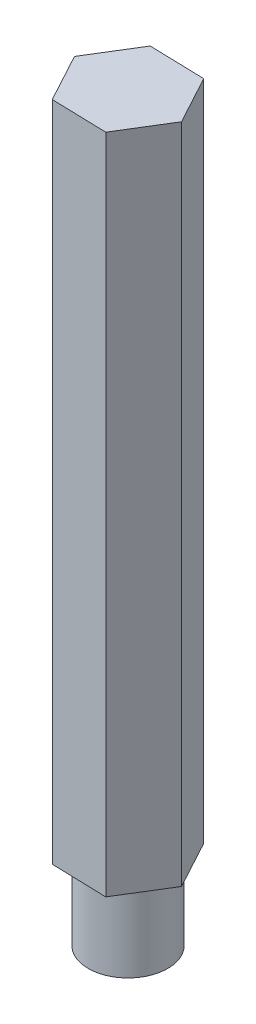
ISO-10303-21;
HEADER;
FILE_DESCRIPTION(('STEP AP214'),'2;1');
FILE_NAME('part.step','',(''),(''),'','','');
FILE_SCHEMA(('AUTOMOTIVE_DESIGN { 1 0 10303 214 1 1 1 1 }'));
ENDSEC;
DATA;
#1=APPLICATION_CONTEXT('core data for automotive mechanical design processes');
#2=APPLICATION_PROTOCOL_DEFINITION('international standard','automotive_design',2000,#1);
#3=PRODUCT_CONTEXT('',#1,'mechanical');
#4=PRODUCT('Part','Part','',(#3));
#5=PRODUCT_RELATED_PRODUCT_CATEGORY('part','',(#4));
#6=PRODUCT_DEFINITION_FORMATION('','',#4);
#7=PRODUCT_DEFINITION_CONTEXT('part definition',#1,'design');
#8=PRODUCT_DEFINITION('design','',#6,#7);
#9=PRODUCT_DEFINITION_SHAPE('','',#8);
#10=(LENGTH_UNIT() NAMED_UNIT(*) SI_UNIT(.MILLI.,.METRE.));
#11=(NAMED_UNIT(*) PLANE_ANGLE_UNIT() SI_UNIT($,.RADIAN.));
#12=(NAMED_UNIT(*) SI_UNIT($,.STERADIAN.) SOLID_ANGLE_UNIT());
#13=UNCERTAINTY_MEASURE_WITH_UNIT(LENGTH_MEASURE(1.E-05),#10,'distance_accuracy_value','');
#14=(GEOMETRIC_REPRESENTATION_CONTEXT(3) GLOBAL_UNCERTAINTY_ASSIGNED_CONTEXT((#13)) GLOBAL_UNIT_ASSIGNED_CONTEXT((#10,
#11,#12)) REPRESENTATION_CONTEXT('',''));
#15=CARTESIAN_POINT('',(0.,0.,0.));
#16=DIRECTION('',(0.,0.,1.));
#17=DIRECTION('',(1.,0.,0.));
#18=AXIS2_PLACEMENT_3D('',#15,#16,#17);
#19=CARTESIAN_POINT('',(0.,3.,0.));
#20=DIRECTION('',(0.,-1.,0.));
#21=DIRECTION('',(0.,0.,-1.));
#22=AXIS2_PLACEMENT_3D('',#19,#20,#21);
#23=CYLINDRICAL_SURFACE('',#22,1.5);
#24=CARTESIAN_POINT('',(0.,3.,0.));
#25=DIRECTION('',(0.,1.,0.));
#26=DIRECTION('',(0.,0.,1.));
#27=AXIS2_PLACEMENT_3D('',#24,#25,#26);
#28=CIRCLE('',#27,1.5);
#29=CARTESIAN_POINT('',(0.,3.,1.5));
#30=VERTEX_POINT('',#29);
#31=EDGE_CURVE('E11',#30,#30,#28,.T.);
#32=ORIENTED_EDGE('',*,*,#31,.F.);
#33=EDGE_LOOP('',(#32));
#34=FACE_BOUND('',#33,.T.);
#35=CARTESIAN_POINT('',(0.,0.,0.));
#36=DIRECTION('',(0.,1.,0.));
#37=DIRECTION('',(0.,0.,1.));
#38=AXIS2_PLACEMENT_3D('',#35,#36,#37);
#39=CIRCLE('',#38,1.5);
#40=CARTESIAN_POINT('',(0.,0.,1.5));
#41=VERTEX_POINT('',#40);
#42=EDGE_CURVE('E38',#41,#41,#39,.T.);
#43=ORIENTED_EDGE('',*,*,#42,.T.);
#44=EDGE_LOOP('',(#43));
#45=FACE_BOUND('',#44,.T.);
#46=ADVANCED_FACE('F35',(#34,#45),#23,.T.);
#47=CARTESIAN_POINT('',(0.,0.,0.));
#48=DIRECTION('',(0.,1.,0.));
#49=DIRECTION('',(0.,0.,1.));
#50=AXIS2_PLACEMENT_3D('',#47,#48,#49);
#51=PLANE('',#50);
#52=ORIENTED_EDGE('',*,*,#42,.F.);
#53=EDGE_LOOP('',(#52));
#54=FACE_BOUND('',#53,.T.);
#55=ADVANCED_FACE('F143',(#54),#51,.F.);
#56=CARTESIAN_POINT('',(0.,3.,0.));
#57=DIRECTION('',(0.,1.,0.));
#58=DIRECTION('',(0.,0.,1.));
#59=AXIS2_PLACEMENT_3D('',#56,#57,#58);
#60=PLANE('',#59);
#61=DIRECTION('',(-0.999619051100166,0.,-0.0275998673475779));
#62=VECTOR('',#61,1.);
#63=CARTESIAN_POINT('',(1.08851435205721,3.,-1.7706316684634));
#64=LINE('',#63,#62);
#65=CARTESIAN_POINT('',(1.08851435205721,3.,-1.7706316684634));
#66=VERTEX_POINT('',#65);
#67=CARTESIAN_POINT('',(-0.989154829605925,3.,-1.8279969154972));
#68=VERTEX_POINT('',#67);
#69=EDGE_CURVE('E120',#66,#68,#64,.T.);
#70=ORIENTED_EDGE('',*,*,#69,.F.);
#71=DIRECTION('',(-0.475907339286,0.,-0.879495426033427));
#72=VECTOR('',#71,1.);
#73=CARTESIAN_POINT('',(2.07766918166313,3.,0.0573652470337994));
#74=LINE('',#73,#72);
#75=CARTESIAN_POINT('',(2.07766918166313,3.,0.0573652470337994));
#76=VERTEX_POINT('',#75);
#77=EDGE_CURVE('E80',#76,#66,#74,.T.);
#78=ORIENTED_EDGE('',*,*,#77,.F.);
#79=DIRECTION('',(0.523711711814166,0.,-0.85189555868585));
#80=VECTOR('',#79,1.);
#81=CARTESIAN_POINT('',(0.989154829605927,3.,1.8279969154972));
#82=LINE('',#81,#80);
#83=CARTESIAN_POINT('',(0.989154829605927,3.,1.8279969154972));
#84=VERTEX_POINT('',#83);
#85=EDGE_CURVE('E74',#84,#76,#82,.T.);
#86=ORIENTED_EDGE('',*,*,#85,.F.);
#87=DIRECTION('',(0.999619051100166,0.,0.0275998673475778));
#88=VECTOR('',#87,1.);
#89=CARTESIAN_POINT('',(-1.0885143520572,3.,1.7706316684634));
#90=LINE('',#89,#88);
#91=CARTESIAN_POINT('',(-1.0885143520572,3.,1.7706316684634));
#92=VERTEX_POINT('',#91);
#93=EDGE_CURVE('E110',#92,#84,#90,.T.);
#94=ORIENTED_EDGE('',*,*,#93,.F.);
#95=DIRECTION('',(0.475907339286,0.,0.879495426033427));
#96=VECTOR('',#95,1.);
#97=CARTESIAN_POINT('',(-2.07766918166313,3.,-0.0573652470337996));
#98=LINE('',#97,#96);
#99=CARTESIAN_POINT('',(-2.07766918166313,3.,-0.0573652470337996));
#100=VERTEX_POINT('',#99);
#101=EDGE_CURVE('E125',#100,#92,#98,.T.);
#102=ORIENTED_EDGE('',*,*,#101,.F.);
#103=DIRECTION('',(-0.523711711814166,0.,0.85189555868585));
#104=VECTOR('',#103,1.);
#105=CARTESIAN_POINT('',(-0.989154829605925,3.,-1.8279969154972));
#106=LINE('',#105,#104);
#107=EDGE_CURVE('E123',#68,#100,#106,.T.);
#108=ORIENTED_EDGE('',*,*,#107,.F.);
#109=EDGE_LOOP('',(#70,#78,#86,#94,#102,#108));
#110=FACE_BOUND('',#109,.T.);
#111=ORIENTED_EDGE('',*,*,#31,.T.);
#112=EDGE_LOOP('',(#111));
#113=FACE_BOUND('',#112,.T.);
#114=ADVANCED_FACE('F145',(#110,#113),#60,.F.);
#115=CARTESIAN_POINT('',(1.08851435205721,28.,-1.7706316684634));
#116=DIRECTION('',(-0.0275998673475779,0.,0.999619051100166));
#117=DIRECTION('',(0.999619051100166,0.,0.0275998673475779));
#118=AXIS2_PLACEMENT_3D('',#115,#116,#117);
#119=PLANE('',#118);
#120=ORIENTED_EDGE('',*,*,#69,.T.);
#121=DIRECTION('',(0.,-1.,0.));
#122=VECTOR('',#121,1.);
#123=CARTESIAN_POINT('',(-0.989154829605925,28.,-1.8279969154972));
#124=LINE('',#123,#122);
#125=CARTESIAN_POINT('',(-0.989154829605925,28.,-1.8279969154972));
#126=VERTEX_POINT('',#125);
#127=EDGE_CURVE('E137',#126,#68,#124,.T.);
#128=ORIENTED_EDGE('',*,*,#127,.F.);
#129=DIRECTION('',(-0.999619051100166,0.,-0.0275998673475779));
#130=VECTOR('',#129,1.);
#131=CARTESIAN_POINT('',(1.08851435205721,28.,-1.7706316684634));
#132=LINE('',#131,#130);
#133=CARTESIAN_POINT('',(1.08851435205721,28.,-1.7706316684634));
#134=VERTEX_POINT('',#133);
#135=EDGE_CURVE('E130',#134,#126,#132,.T.);
#136=ORIENTED_EDGE('',*,*,#135,.F.);
#137=DIRECTION('',(0.,-1.,0.));
#138=VECTOR('',#137,1.);
#139=CARTESIAN_POINT('',(1.08851435205721,28.,-1.7706316684634));
#140=LINE('',#139,#138);
#141=EDGE_CURVE('E116',#134,#66,#140,.T.);
#142=ORIENTED_EDGE('',*,*,#141,.T.);
#143=EDGE_LOOP('',(#120,#128,#136,#142));
#144=FACE_BOUND('',#143,.T.);
#145=ADVANCED_FACE('F150',(#144),#119,.F.);
#146=CARTESIAN_POINT('',(-0.989154829605925,28.,-1.8279969154972));
#147=DIRECTION('',(0.85189555868585,0.,0.523711711814166));
#148=DIRECTION('',(0.523711711814166,0.,-0.85189555868585));
#149=AXIS2_PLACEMENT_3D('',#146,#147,#148);
#150=PLANE('',#149);
#151=ORIENTED_EDGE('',*,*,#107,.T.);
#152=DIRECTION('',(0.,-1.,0.));
#153=VECTOR('',#152,1.);
#154=CARTESIAN_POINT('',(-2.07766918166313,28.,-0.0573652470337996));
#155=LINE('',#154,#153);
#156=CARTESIAN_POINT('',(-2.07766918166313,28.,-0.0573652470337996));
#157=VERTEX_POINT('',#156);
#158=EDGE_CURVE('E134',#157,#100,#155,.T.);
#159=ORIENTED_EDGE('',*,*,#158,.F.);
#160=DIRECTION('',(-0.523711711814166,0.,0.85189555868585));
#161=VECTOR('',#160,1.);
#162=CARTESIAN_POINT('',(-0.989154829605925,28.,-1.8279969154972));
#163=LINE('',#162,#161);
#164=EDGE_CURVE('E89',#126,#157,#163,.T.);
#165=ORIENTED_EDGE('',*,*,#164,.F.);
#166=ORIENTED_EDGE('',*,*,#127,.T.);
#167=EDGE_LOOP('',(#151,#159,#165,#166));
#168=FACE_BOUND('',#167,.T.);
#169=ADVANCED_FACE('F157',(#168),#150,.F.);
#170=CARTESIAN_POINT('',(-2.07766918166313,28.,-0.0573652470337996));
#171=DIRECTION('',(0.879495426033427,0.,-0.475907339286));
#172=DIRECTION('',(-0.475907339286,0.,-0.879495426033427));
#173=AXIS2_PLACEMENT_3D('',#170,#171,#172);
#174=PLANE('',#173);
#175=ORIENTED_EDGE('',*,*,#101,.T.);
#176=DIRECTION('',(0.,-1.,0.));
#177=VECTOR('',#176,1.);
#178=CARTESIAN_POINT('',(-1.0885143520572,28.,1.7706316684634));
#179=LINE('',#178,#177);
#180=CARTESIAN_POINT('',(-1.0885143520572,28.,1.7706316684634));
#181=VERTEX_POINT('',#180);
#182=EDGE_CURVE('E111',#181,#92,#179,.T.);
#183=ORIENTED_EDGE('',*,*,#182,.F.);
#184=DIRECTION('',(0.475907339286,0.,0.879495426033427));
#185=VECTOR('',#184,1.);
#186=CARTESIAN_POINT('',(-2.07766918166313,28.,-0.0573652470337996));
#187=LINE('',#186,#185);
#188=EDGE_CURVE('E102',#157,#181,#187,.T.);
#189=ORIENTED_EDGE('',*,*,#188,.F.);
#190=ORIENTED_EDGE('',*,*,#158,.T.);
#191=EDGE_LOOP('',(#175,#183,#189,#190));
#192=FACE_BOUND('',#191,.T.);
#193=ADVANCED_FACE('F161',(#192),#174,.F.);
#194=CARTESIAN_POINT('',(-1.0885143520572,28.,1.7706316684634));
#195=DIRECTION('',(0.0275998673475778,0.,-0.999619051100166));
#196=DIRECTION('',(-0.999619051100166,0.,-0.0275998673475778));
#197=AXIS2_PLACEMENT_3D('',#194,#195,#196);
#198=PLANE('',#197);
#199=ORIENTED_EDGE('',*,*,#93,.T.);
#200=DIRECTION('',(0.,-1.,0.));
#201=VECTOR('',#200,1.);
#202=CARTESIAN_POINT('',(0.989154829605927,28.,1.8279969154972));
#203=LINE('',#202,#201);
#204=CARTESIAN_POINT('',(0.989154829605927,28.,1.8279969154972));
#205=VERTEX_POINT('',#204);
#206=EDGE_CURVE('E107',#205,#84,#203,.T.);
#207=ORIENTED_EDGE('',*,*,#206,.F.);
#208=DIRECTION('',(0.999619051100166,0.,0.0275998673475778));
#209=VECTOR('',#208,1.);
#210=CARTESIAN_POINT('',(-1.0885143520572,28.,1.7706316684634));
#211=LINE('',#210,#209);
#212=EDGE_CURVE('E96',#181,#205,#211,.T.);
#213=ORIENTED_EDGE('',*,*,#212,.F.);
#214=ORIENTED_EDGE('',*,*,#182,.T.);
#215=EDGE_LOOP('',(#199,#207,#213,#214));
#216=FACE_BOUND('',#215,.T.);
#217=ADVANCED_FACE('F108',(#216),#198,.F.);
#218=CARTESIAN_POINT('',(0.989154829605927,28.,1.8279969154972));
#219=DIRECTION('',(-0.85189555868585,0.,-0.523711711814166));
#220=DIRECTION('',(-0.523711711814166,0.,0.85189555868585));
#221=AXIS2_PLACEMENT_3D('',#218,#219,#220);
#222=PLANE('',#221);
#223=ORIENTED_EDGE('',*,*,#85,.T.);
#224=DIRECTION('',(0.,-1.,0.));
#225=VECTOR('',#224,1.);
#226=CARTESIAN_POINT('',(2.07766918166313,28.,0.0573652470337994));
#227=LINE('',#226,#225);
#228=CARTESIAN_POINT('',(2.07766918166313,28.,0.0573652470337994));
#229=VERTEX_POINT('',#228);
#230=EDGE_CURVE('E112',#229,#76,#227,.T.);
#231=ORIENTED_EDGE('',*,*,#230,.F.);
#232=DIRECTION('',(0.523711711814166,0.,-0.85189555868585));
#233=VECTOR('',#232,1.);
#234=CARTESIAN_POINT('',(0.989154829605927,28.,1.8279969154972));
#235=LINE('',#234,#233);
#236=EDGE_CURVE('E100',#205,#229,#235,.T.);
#237=ORIENTED_EDGE('',*,*,#236,.F.);
#238=ORIENTED_EDGE('',*,*,#206,.T.);
#239=EDGE_LOOP('',(#223,#231,#237,#238));
#240=FACE_BOUND('',#239,.T.);
#241=ADVANCED_FACE('F114',(#240),#222,.F.);
#242=CARTESIAN_POINT('',(2.07766918166313,28.,0.0573652470337994));
#243=DIRECTION('',(-0.879495426033427,0.,0.475907339286));
#244=DIRECTION('',(0.475907339286,0.,0.879495426033427));
#245=AXIS2_PLACEMENT_3D('',#242,#243,#244);
#246=PLANE('',#245);
#247=ORIENTED_EDGE('',*,*,#77,.T.);
#248=ORIENTED_EDGE('',*,*,#141,.F.);
#249=DIRECTION('',(-0.475907339286,0.,-0.879495426033427));
#250=VECTOR('',#249,1.);
#251=CARTESIAN_POINT('',(2.07766918166313,28.,0.0573652470337994));
#252=LINE('',#251,#250);
#253=EDGE_CURVE('E51',#229,#134,#252,.T.);
#254=ORIENTED_EDGE('',*,*,#253,.F.);
#255=ORIENTED_EDGE('',*,*,#230,.T.);
#256=EDGE_LOOP('',(#247,#248,#254,#255));
#257=FACE_BOUND('',#256,.T.);
#258=ADVANCED_FACE('F169',(#257),#246,.F.);
#259=CARTESIAN_POINT('',(0.,28.,0.));
#260=DIRECTION('',(0.,1.,0.));
#261=DIRECTION('',(0.,0.,1.));
#262=AXIS2_PLACEMENT_3D('',#259,#260,#261);
#263=PLANE('',#262);
#264=ORIENTED_EDGE('',*,*,#135,.T.);
#265=ORIENTED_EDGE('',*,*,#164,.T.);
#266=ORIENTED_EDGE('',*,*,#188,.T.);
#267=ORIENTED_EDGE('',*,*,#212,.T.);
#268=ORIENTED_EDGE('',*,*,#236,.T.);
#269=ORIENTED_EDGE('',*,*,#253,.T.);
#270=EDGE_LOOP('',(#264,#265,#266,#267,#268,#269));
#271=FACE_BOUND('',#270,.T.);
#272=ADVANCED_FACE('F98',(#271),#263,.T.);
#273=CLOSED_SHELL('',(#46,#55,#114,#145,#169,#193,#217,#241,#258,#272));
#274=MANIFOLD_SOLID_BREP('B2',#273);
#275=ADVANCED_BREP_SHAPE_REPRESENTATION('',(#18,#274),#14);
#276=SHAPE_DEFINITION_REPRESENTATION(#9,#275);
ENDSEC;
END-ISO-10303-21;
